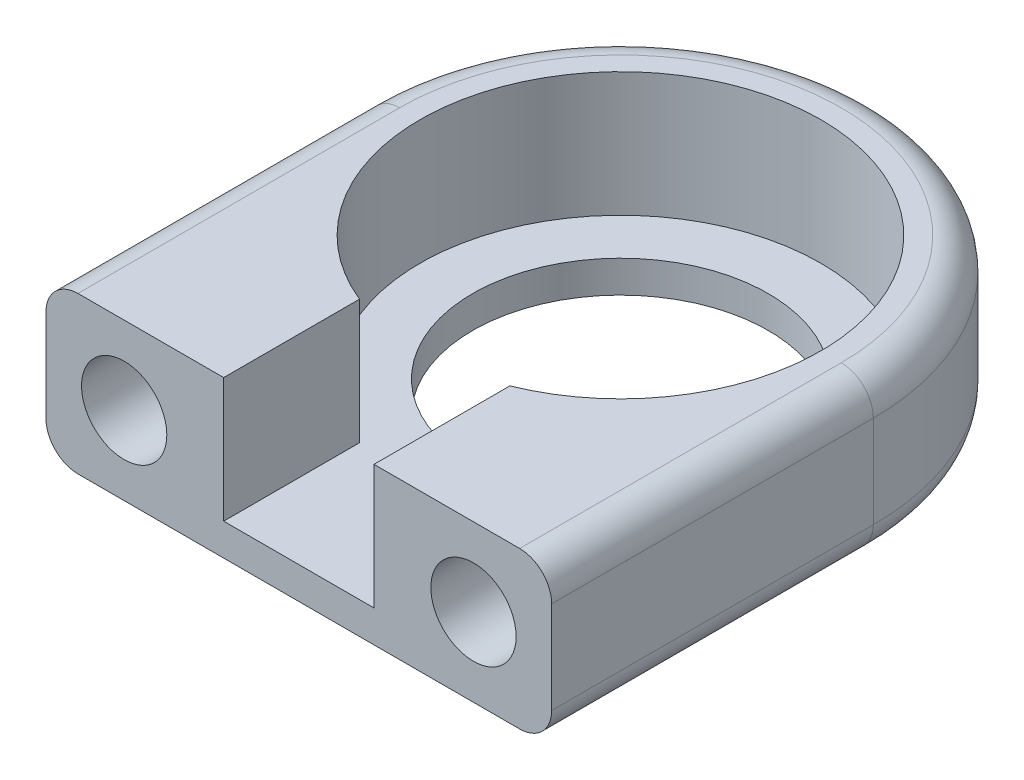
ISO-10303-21;
HEADER;
FILE_DESCRIPTION(('STEP AP214'),'2;1');
FILE_NAME('part.step','',(''),(''),'','','');
FILE_SCHEMA(('AUTOMOTIVE_DESIGN { 1 0 10303 214 1 1 1 1 }'));
ENDSEC;
DATA;
#1=APPLICATION_CONTEXT('core data for automotive mechanical design processes');
#2=APPLICATION_PROTOCOL_DEFINITION('international standard','automotive_design',2000,#1);
#3=PRODUCT_CONTEXT('',#1,'mechanical');
#4=PRODUCT('Part','Part','',(#3));
#5=PRODUCT_RELATED_PRODUCT_CATEGORY('part','',(#4));
#6=PRODUCT_DEFINITION_FORMATION('','',#4);
#7=PRODUCT_DEFINITION_CONTEXT('part definition',#1,'design');
#8=PRODUCT_DEFINITION('design','',#6,#7);
#9=PRODUCT_DEFINITION_SHAPE('','',#8);
#10=(LENGTH_UNIT() NAMED_UNIT(*) SI_UNIT(.MILLI.,.METRE.));
#11=(NAMED_UNIT(*) PLANE_ANGLE_UNIT() SI_UNIT($,.RADIAN.));
#12=(NAMED_UNIT(*) SI_UNIT($,.STERADIAN.) SOLID_ANGLE_UNIT());
#13=UNCERTAINTY_MEASURE_WITH_UNIT(LENGTH_MEASURE(1.E-05),#10,'distance_accuracy_value','');
#14=(GEOMETRIC_REPRESENTATION_CONTEXT(3) GLOBAL_UNCERTAINTY_ASSIGNED_CONTEXT((#13)) GLOBAL_UNIT_ASSIGNED_CONTEXT((#10,
#11,#12)) REPRESENTATION_CONTEXT('',''));
#15=CARTESIAN_POINT('',(0.,0.,0.));
#16=DIRECTION('',(0.,0.,1.));
#17=DIRECTION('',(1.,0.,0.));
#18=AXIS2_PLACEMENT_3D('',#15,#16,#17);
#19=CARTESIAN_POINT('',(0.,11.,0.));
#20=DIRECTION('',(0.,-1.,0.));
#21=DIRECTION('',(0.,0.,-1.));
#22=AXIS2_PLACEMENT_3D('',#19,#20,#21);
#23=CYLINDRICAL_SURFACE('',#22,14.0975);
#24=DIRECTION('',(0.,-1.,0.));
#25=VECTOR('',#24,1.);
#26=CARTESIAN_POINT('',(5.2875,11.,13.0683529949263));
#27=LINE('',#26,#25);
#28=CARTESIAN_POINT('',(5.2875,11.,13.0683529949263));
#29=VERTEX_POINT('',#28);
#30=CARTESIAN_POINT('',(5.2875,2.25,13.0683529949263));
#31=VERTEX_POINT('',#30);
#32=EDGE_CURVE('E141',#29,#31,#27,.T.);
#33=ORIENTED_EDGE('',*,*,#32,.F.);
#34=CARTESIAN_POINT('',(0.,11.,0.));
#35=DIRECTION('',(0.,1.,0.));
#36=DIRECTION('',(0.,0.,1.));
#37=AXIS2_PLACEMENT_3D('',#34,#35,#36);
#38=CIRCLE('',#37,14.0975);
#39=CARTESIAN_POINT('',(-5.2875,11.,13.0683529949263));
#40=VERTEX_POINT('',#39);
#41=EDGE_CURVE('E176',#29,#40,#38,.T.);
#42=ORIENTED_EDGE('',*,*,#41,.T.);
#43=DIRECTION('',(0.,-1.,0.));
#44=VECTOR('',#43,1.);
#45=CARTESIAN_POINT('',(-5.2875,11.,13.0683529949263));
#46=LINE('',#45,#44);
#47=CARTESIAN_POINT('',(-5.2875,2.25,13.0683529949263));
#48=VERTEX_POINT('',#47);
#49=EDGE_CURVE('E161',#48,#40,#46,.F.);
#50=ORIENTED_EDGE('',*,*,#49,.F.);
#51=CARTESIAN_POINT('',(0.,2.25,0.));
#52=DIRECTION('',(0.,-1.,0.));
#53=DIRECTION('',(0.,0.,-1.));
#54=AXIS2_PLACEMENT_3D('',#51,#52,#53);
#55=CIRCLE('',#54,14.0975);
#56=EDGE_CURVE('E173',#48,#31,#55,.T.);
#57=ORIENTED_EDGE('',*,*,#56,.T.);
#58=EDGE_LOOP('',(#33,#42,#50,#57));
#59=FACE_BOUND('',#58,.T.);
#60=ADVANCED_FACE('F39',(#59),#23,.F.);
#61=CARTESIAN_POINT('',(0.,11.,0.));
#62=DIRECTION('',(0.,1.,0.));
#63=DIRECTION('',(0.,0.,1.));
#64=AXIS2_PLACEMENT_3D('',#61,#62,#63);
#65=PLANE('',#64);
#66=DIRECTION('',(1.,0.,0.));
#67=VECTOR('',#66,1.);
#68=CARTESIAN_POINT('',(-17.7875,11.,22.6280707264182));
#69=LINE('',#68,#67);
#70=CARTESIAN_POINT('',(5.2875,11.,22.6280707264182));
#71=VERTEX_POINT('',#70);
#72=CARTESIAN_POINT('',(15.5375,11.,22.6280707264182));
#73=VERTEX_POINT('',#72);
#74=EDGE_CURVE('E160',#71,#73,#69,.T.);
#75=ORIENTED_EDGE('',*,*,#74,.T.);
#76=DIRECTION('',(0.,0.,-1.));
#77=VECTOR('',#76,1.);
#78=CARTESIAN_POINT('',(15.5375,11.,0.));
#79=LINE('',#78,#77);
#80=CARTESIAN_POINT('',(15.5375,11.,0.));
#81=VERTEX_POINT('',#80);
#82=EDGE_CURVE('E260',#73,#81,#79,.T.);
#83=ORIENTED_EDGE('',*,*,#82,.T.);
#84=CARTESIAN_POINT('',(0.,11.,0.));
#85=DIRECTION('',(0.,1.,0.));
#86=DIRECTION('',(0.,0.,1.));
#87=AXIS2_PLACEMENT_3D('',#84,#85,#86);
#88=CIRCLE('',#87,15.5375);
#89=CARTESIAN_POINT('',(-15.5375,11.,0.));
#90=VERTEX_POINT('',#89);
#91=EDGE_CURVE('E258',#81,#90,#88,.T.);
#92=ORIENTED_EDGE('',*,*,#91,.T.);
#93=DIRECTION('',(0.,0.,1.));
#94=VECTOR('',#93,1.);
#95=CARTESIAN_POINT('',(-15.5375,11.,22.6280707264182));
#96=LINE('',#95,#94);
#97=CARTESIAN_POINT('',(-15.5375,11.,22.6280707264182));
#98=VERTEX_POINT('',#97);
#99=EDGE_CURVE('E249',#90,#98,#96,.T.);
#100=ORIENTED_EDGE('',*,*,#99,.T.);
#101=CARTESIAN_POINT('',(-5.2875,11.,22.6280707264182));
#102=VERTEX_POINT('',#101);
#103=EDGE_CURVE('E180',#98,#102,#69,.T.);
#104=ORIENTED_EDGE('',*,*,#103,.T.);
#105=DIRECTION('',(0.,0.,1.));
#106=VECTOR('',#105,1.);
#107=CARTESIAN_POINT('',(-5.2875,11.,10.3998125081596));
#108=LINE('',#107,#106);
#109=EDGE_CURVE('E146',#40,#102,#108,.T.);
#110=ORIENTED_EDGE('',*,*,#109,.F.);
#111=ORIENTED_EDGE('',*,*,#41,.F.);
#112=DIRECTION('',(0.,0.,-1.));
#113=VECTOR('',#112,1.);
#114=CARTESIAN_POINT('',(5.2875,11.,22.6280707264182));
#115=LINE('',#114,#113);
#116=EDGE_CURVE('E289',#71,#29,#115,.T.);
#117=ORIENTED_EDGE('',*,*,#116,.F.);
#118=EDGE_LOOP('',(#75,#83,#92,#100,#104,#110,#111,#117));
#119=FACE_BOUND('',#118,.T.);
#120=ADVANCED_FACE('F282',(#119),#65,.T.);
#121=CARTESIAN_POINT('',(0.,0.,0.));
#122=DIRECTION('',(0.,1.,0.));
#123=DIRECTION('',(0.,0.,1.));
#124=AXIS2_PLACEMENT_3D('',#121,#122,#123);
#125=PLANE('',#124);
#126=CARTESIAN_POINT('',(0.,0.,0.));
#127=DIRECTION('',(0.,1.,0.));
#128=DIRECTION('',(0.,0.,1.));
#129=AXIS2_PLACEMENT_3D('',#126,#127,#128);
#130=CIRCLE('',#129,10.4);
#131=CARTESIAN_POINT('',(0.,0.,10.4));
#132=VERTEX_POINT('',#131);
#133=EDGE_CURVE('E170',#132,#132,#130,.T.);
#134=ORIENTED_EDGE('',*,*,#133,.T.);
#135=EDGE_LOOP('',(#134));
#136=FACE_BOUND('',#135,.T.);
#137=DIRECTION('',(1.,0.,0.));
#138=VECTOR('',#137,1.);
#139=CARTESIAN_POINT('',(-17.7875,0.,22.6280707264182));
#140=LINE('',#139,#138);
#141=CARTESIAN_POINT('',(-15.5375,0.,22.6280707264182));
#142=VERTEX_POINT('',#141);
#143=CARTESIAN_POINT('',(15.5375,0.,22.6280707264182));
#144=VERTEX_POINT('',#143);
#145=EDGE_CURVE('E179',#142,#144,#140,.T.);
#146=ORIENTED_EDGE('',*,*,#145,.F.);
#147=DIRECTION('',(0.,0.,1.));
#148=VECTOR('',#147,1.);
#149=CARTESIAN_POINT('',(-15.5375,0.,0.));
#150=LINE('',#149,#148);
#151=CARTESIAN_POINT('',(-15.5375,0.,0.));
#152=VERTEX_POINT('',#151);
#153=EDGE_CURVE('E241',#142,#152,#150,.F.);
#154=ORIENTED_EDGE('',*,*,#153,.T.);
#155=CARTESIAN_POINT('',(0.,0.,0.));
#156=DIRECTION('',(0.,1.,0.));
#157=DIRECTION('',(0.,0.,1.));
#158=AXIS2_PLACEMENT_3D('',#155,#156,#157);
#159=CIRCLE('',#158,15.5375);
#160=CARTESIAN_POINT('',(15.5375,0.,0.));
#161=VERTEX_POINT('',#160);
#162=EDGE_CURVE('E239',#152,#161,#159,.F.);
#163=ORIENTED_EDGE('',*,*,#162,.T.);
#164=DIRECTION('',(0.,0.,-1.));
#165=VECTOR('',#164,1.);
#166=CARTESIAN_POINT('',(15.5375,0.,0.));
#167=LINE('',#166,#165);
#168=EDGE_CURVE('E237',#161,#144,#167,.F.);
#169=ORIENTED_EDGE('',*,*,#168,.T.);
#170=EDGE_LOOP('',(#146,#154,#163,#169));
#171=FACE_BOUND('',#170,.T.);
#172=ADVANCED_FACE('F329',(#136,#171),#125,.F.);
#173=CARTESIAN_POINT('',(0.,11.,0.));
#174=DIRECTION('',(0.,-1.,0.));
#175=DIRECTION('',(0.,0.,-1.));
#176=AXIS2_PLACEMENT_3D('',#173,#174,#175);
#177=CYLINDRICAL_SURFACE('',#176,17.7875);
#178=DIRECTION('',(0.,-1.,0.));
#179=VECTOR('',#178,1.);
#180=CARTESIAN_POINT('',(-17.7875,11.,0.));
#181=LINE('',#180,#179);
#182=CARTESIAN_POINT('',(-17.7875,8.75,0.));
#183=VERTEX_POINT('',#182);
#184=CARTESIAN_POINT('',(-17.7875,2.25,0.));
#185=VERTEX_POINT('',#184);
#186=EDGE_CURVE('E190',#183,#185,#181,.T.);
#187=ORIENTED_EDGE('',*,*,#186,.F.);
#188=CARTESIAN_POINT('',(0.,8.75,0.));
#189=DIRECTION('',(0.,1.,0.));
#190=DIRECTION('',(0.,0.,1.));
#191=AXIS2_PLACEMENT_3D('',#188,#189,#190);
#192=CIRCLE('',#191,17.7875);
#193=CARTESIAN_POINT('',(17.7875,8.75,0.));
#194=VERTEX_POINT('',#193);
#195=EDGE_CURVE('E48',#183,#194,#192,.F.);
#196=ORIENTED_EDGE('',*,*,#195,.T.);
#197=DIRECTION('',(0.,-1.,0.));
#198=VECTOR('',#197,1.);
#199=CARTESIAN_POINT('',(17.7875,11.,0.));
#200=LINE('',#199,#198);
#201=CARTESIAN_POINT('',(17.7875,2.25,0.));
#202=VERTEX_POINT('',#201);
#203=EDGE_CURVE('E182',#194,#202,#200,.T.);
#204=ORIENTED_EDGE('',*,*,#203,.T.);
#205=CARTESIAN_POINT('',(0.,2.25,0.));
#206=DIRECTION('',(0.,1.,0.));
#207=DIRECTION('',(0.,0.,1.));
#208=AXIS2_PLACEMENT_3D('',#205,#206,#207);
#209=CIRCLE('',#208,17.7875);
#210=EDGE_CURVE('E243',#202,#185,#209,.T.);
#211=ORIENTED_EDGE('',*,*,#210,.T.);
#212=EDGE_LOOP('',(#187,#196,#204,#211));
#213=FACE_BOUND('',#212,.T.);
#214=ADVANCED_FACE('F338',(#213),#177,.T.);
#215=CARTESIAN_POINT('',(-17.7875,11.,0.));
#216=DIRECTION('',(1.,0.,0.));
#217=DIRECTION('',(0.,0.,-1.));
#218=AXIS2_PLACEMENT_3D('',#215,#216,#217);
#219=PLANE('',#218);
#220=DIRECTION('',(0.,-1.,0.));
#221=VECTOR('',#220,1.);
#222=CARTESIAN_POINT('',(-17.7875,11.,22.6280707264182));
#223=LINE('',#222,#221);
#224=CARTESIAN_POINT('',(-17.7875,8.75,22.6280707264182));
#225=VERTEX_POINT('',#224);
#226=CARTESIAN_POINT('',(-17.7875,2.25,22.6280707264182));
#227=VERTEX_POINT('',#226);
#228=EDGE_CURVE('E188',#225,#227,#223,.T.);
#229=ORIENTED_EDGE('',*,*,#228,.F.);
#230=DIRECTION('',(0.,0.,1.));
#231=VECTOR('',#230,1.);
#232=CARTESIAN_POINT('',(-17.7875,8.75,0.));
#233=LINE('',#232,#231);
#234=EDGE_CURVE('E11',#225,#183,#233,.F.);
#235=ORIENTED_EDGE('',*,*,#234,.T.);
#236=ORIENTED_EDGE('',*,*,#186,.T.);
#237=DIRECTION('',(0.,0.,1.));
#238=VECTOR('',#237,1.);
#239=CARTESIAN_POINT('',(-17.7875,2.25,0.));
#240=LINE('',#239,#238);
#241=EDGE_CURVE('E192',#185,#227,#240,.T.);
#242=ORIENTED_EDGE('',*,*,#241,.T.);
#243=EDGE_LOOP('',(#229,#235,#236,#242));
#244=FACE_BOUND('',#243,.T.);
#245=ADVANCED_FACE('F308',(#244),#219,.F.);
#246=CARTESIAN_POINT('',(-17.7875,11.,22.6280707264182));
#247=DIRECTION('',(0.,0.,-1.));
#248=DIRECTION('',(-1.,0.,0.));
#249=AXIS2_PLACEMENT_3D('',#246,#247,#248);
#250=PLANE('',#249);
#251=CARTESIAN_POINT('',(-12.2875,5.5,22.6280707264182));
#252=DIRECTION('',(0.,0.,1.));
#253=DIRECTION('',(1.,0.,0.));
#254=AXIS2_PLACEMENT_3D('',#251,#252,#253);
#255=CIRCLE('',#254,3.);
#256=CARTESIAN_POINT('',(-9.2875,5.5,22.6280707264182));
#257=VERTEX_POINT('',#256);
#258=EDGE_CURVE('E292',#257,#257,#255,.T.);
#259=ORIENTED_EDGE('',*,*,#258,.F.);
#260=EDGE_LOOP('',(#259));
#261=FACE_BOUND('',#260,.T.);
#262=CARTESIAN_POINT('',(12.2875,5.5,22.6280707264182));
#263=DIRECTION('',(0.,0.,1.));
#264=DIRECTION('',(1.,0.,0.));
#265=AXIS2_PLACEMENT_3D('',#262,#263,#264);
#266=CIRCLE('',#265,3.);
#267=CARTESIAN_POINT('',(15.2875,5.5,22.6280707264182));
#268=VERTEX_POINT('',#267);
#269=EDGE_CURVE('E256',#268,#268,#266,.T.);
#270=ORIENTED_EDGE('',*,*,#269,.F.);
#271=EDGE_LOOP('',(#270));
#272=FACE_BOUND('',#271,.T.);
#273=DIRECTION('',(0.,-1.,0.));
#274=VECTOR('',#273,1.);
#275=CARTESIAN_POINT('',(17.7875,11.,22.6280707264182));
#276=LINE('',#275,#274);
#277=CARTESIAN_POINT('',(17.7875,8.75,22.6280707264182));
#278=VERTEX_POINT('',#277);
#279=CARTESIAN_POINT('',(17.7875,2.25,22.6280707264182));
#280=VERTEX_POINT('',#279);
#281=EDGE_CURVE('E186',#278,#280,#276,.T.);
#282=ORIENTED_EDGE('',*,*,#281,.F.);
#283=CARTESIAN_POINT('',(15.5375,8.75,22.6280707264182));
#284=DIRECTION('',(0.,0.,-1.));
#285=DIRECTION('',(-1.,0.,0.));
#286=AXIS2_PLACEMENT_3D('',#283,#284,#285);
#287=CIRCLE('',#286,2.25);
#288=EDGE_CURVE('E266',#278,#73,#287,.F.);
#289=ORIENTED_EDGE('',*,*,#288,.T.);
#290=ORIENTED_EDGE('',*,*,#74,.F.);
#291=DIRECTION('',(0.,1.,0.));
#292=VECTOR('',#291,1.);
#293=CARTESIAN_POINT('',(5.2875,2.25,22.6280707264182));
#294=LINE('',#293,#292);
#295=CARTESIAN_POINT('',(5.2875,2.25,22.6280707264182));
#296=VERTEX_POINT('',#295);
#297=EDGE_CURVE('E138',#296,#71,#294,.T.);
#298=ORIENTED_EDGE('',*,*,#297,.F.);
#299=DIRECTION('',(1.,0.,0.));
#300=VECTOR('',#299,1.);
#301=CARTESIAN_POINT('',(-5.2875,2.25,22.6280707264182));
#302=LINE('',#301,#300);
#303=CARTESIAN_POINT('',(-5.2875,2.25,22.6280707264182));
#304=VERTEX_POINT('',#303);
#305=EDGE_CURVE('E150',#304,#296,#302,.T.);
#306=ORIENTED_EDGE('',*,*,#305,.F.);
#307=DIRECTION('',(0.,1.,0.));
#308=VECTOR('',#307,1.);
#309=CARTESIAN_POINT('',(-5.2875,2.25,22.6280707264182));
#310=LINE('',#309,#308);
#311=EDGE_CURVE('E154',#304,#102,#310,.T.);
#312=ORIENTED_EDGE('',*,*,#311,.T.);
#313=ORIENTED_EDGE('',*,*,#103,.F.);
#314=CARTESIAN_POINT('',(-15.5375,8.75,22.6280707264182));
#315=DIRECTION('',(0.,0.,-1.));
#316=DIRECTION('',(-1.,0.,0.));
#317=AXIS2_PLACEMENT_3D('',#314,#315,#316);
#318=CIRCLE('',#317,2.25);
#319=EDGE_CURVE('E62',#98,#225,#318,.F.);
#320=ORIENTED_EDGE('',*,*,#319,.T.);
#321=ORIENTED_EDGE('',*,*,#228,.T.);
#322=CARTESIAN_POINT('',(-15.5375,2.25,22.6280707264182));
#323=DIRECTION('',(0.,0.,-1.));
#324=DIRECTION('',(-1.,0.,0.));
#325=AXIS2_PLACEMENT_3D('',#322,#323,#324);
#326=CIRCLE('',#325,2.25);
#327=EDGE_CURVE('E235',#227,#142,#326,.F.);
#328=ORIENTED_EDGE('',*,*,#327,.T.);
#329=ORIENTED_EDGE('',*,*,#145,.T.);
#330=CARTESIAN_POINT('',(15.5375,2.25,22.6280707264182));
#331=DIRECTION('',(0.,0.,-1.));
#332=DIRECTION('',(-1.,0.,0.));
#333=AXIS2_PLACEMENT_3D('',#330,#331,#332);
#334=CIRCLE('',#333,2.25);
#335=EDGE_CURVE('E232',#144,#280,#334,.F.);
#336=ORIENTED_EDGE('',*,*,#335,.T.);
#337=EDGE_LOOP('',(#282,#289,#290,#298,#306,#312,#313,#320,#321,#328,#329,#336));
#338=FACE_BOUND('',#337,.T.);
#339=ADVANCED_FACE('F158',(#261,#272,#338),#250,.F.);
#340=CARTESIAN_POINT('',(17.7875,11.,0.));
#341=DIRECTION('',(-1.,0.,0.));
#342=DIRECTION('',(0.,0.,1.));
#343=AXIS2_PLACEMENT_3D('',#340,#341,#342);
#344=PLANE('',#343);
#345=ORIENTED_EDGE('',*,*,#203,.F.);
#346=DIRECTION('',(0.,0.,-1.));
#347=VECTOR('',#346,1.);
#348=CARTESIAN_POINT('',(17.7875,8.75,22.6280707264182));
#349=LINE('',#348,#347);
#350=EDGE_CURVE('E263',#194,#278,#349,.F.);
#351=ORIENTED_EDGE('',*,*,#350,.T.);
#352=ORIENTED_EDGE('',*,*,#281,.T.);
#353=DIRECTION('',(0.,0.,-1.));
#354=VECTOR('',#353,1.);
#355=CARTESIAN_POINT('',(17.7875,2.25,0.));
#356=LINE('',#355,#354);
#357=EDGE_CURVE('E246',#280,#202,#356,.T.);
#358=ORIENTED_EDGE('',*,*,#357,.T.);
#359=EDGE_LOOP('',(#345,#351,#352,#358));
#360=FACE_BOUND('',#359,.T.);
#361=ADVANCED_FACE('F217',(#360),#344,.F.);
#362=CARTESIAN_POINT('',(0.,2.25,0.));
#363=DIRECTION('',(0.,-1.,0.));
#364=DIRECTION('',(0.,0.,-1.));
#365=AXIS2_PLACEMENT_3D('',#362,#363,#364);
#366=PLANE('',#365);
#367=ORIENTED_EDGE('',*,*,#56,.F.);
#368=DIRECTION('',(0.,0.,1.));
#369=VECTOR('',#368,1.);
#370=CARTESIAN_POINT('',(-5.2875,2.25,10.3998125081596));
#371=LINE('',#370,#369);
#372=EDGE_CURVE('E145',#48,#304,#371,.T.);
#373=ORIENTED_EDGE('',*,*,#372,.T.);
#374=ORIENTED_EDGE('',*,*,#305,.T.);
#375=DIRECTION('',(0.,0.,-1.));
#376=VECTOR('',#375,1.);
#377=CARTESIAN_POINT('',(5.2875,2.25,22.6280707264182));
#378=LINE('',#377,#376);
#379=EDGE_CURVE('E134',#296,#31,#378,.T.);
#380=ORIENTED_EDGE('',*,*,#379,.T.);
#381=EDGE_LOOP('',(#367,#373,#374,#380));
#382=FACE_BOUND('',#381,.T.);
#383=CARTESIAN_POINT('',(0.,2.25,0.));
#384=DIRECTION('',(0.,1.,0.));
#385=DIRECTION('',(-0.00600464804505152,0.,0.999981971938422));
#386=AXIS2_PLACEMENT_3D('',#383,#384,#385);
#387=CIRCLE('',#386,10.4);
#388=CARTESIAN_POINT('',(-0.0624483396685354,2.25,10.3998125081596));
#389=VERTEX_POINT('',#388);
#390=CARTESIAN_POINT('',(0.0624483396685354,2.25,10.3998125081596));
#391=VERTEX_POINT('',#390);
#392=EDGE_CURVE('E169',#389,#391,#387,.T.);
#393=ORIENTED_EDGE('',*,*,#392,.F.);
#394=CARTESIAN_POINT('',(0.,2.25,0.));
#395=DIRECTION('',(0.,1.,0.));
#396=DIRECTION('',(0.,0.,1.));
#397=AXIS2_PLACEMENT_3D('',#394,#395,#396);
#398=CIRCLE('',#397,10.4);
#399=EDGE_CURVE('E174',#391,#389,#398,.T.);
#400=ORIENTED_EDGE('',*,*,#399,.F.);
#401=EDGE_LOOP('',(#393,#400));
#402=FACE_BOUND('',#401,.T.);
#403=ADVANCED_FACE('F151',(#382,#402),#366,.F.);
#404=CARTESIAN_POINT('',(0.,0.,0.));
#405=DIRECTION('',(0.,1.,0.));
#406=DIRECTION('',(0.,0.,1.));
#407=AXIS2_PLACEMENT_3D('',#404,#405,#406);
#408=CYLINDRICAL_SURFACE('',#407,10.4);
#409=ORIENTED_EDGE('',*,*,#133,.F.);
#410=EDGE_LOOP('',(#409));
#411=FACE_BOUND('',#410,.T.);
#412=ORIENTED_EDGE('',*,*,#399,.T.);
#413=ORIENTED_EDGE('',*,*,#392,.T.);
#414=EDGE_LOOP('',(#412,#413));
#415=FACE_BOUND('',#414,.T.);
#416=ADVANCED_FACE('F202',(#411,#415),#408,.F.);
#417=CARTESIAN_POINT('',(5.2875,2.25,22.6280707264182));
#418=DIRECTION('',(1.,0.,0.));
#419=DIRECTION('',(0.,0.,-1.));
#420=AXIS2_PLACEMENT_3D('',#417,#418,#419);
#421=PLANE('',#420);
#422=ORIENTED_EDGE('',*,*,#32,.T.);
#423=ORIENTED_EDGE('',*,*,#379,.F.);
#424=ORIENTED_EDGE('',*,*,#297,.T.);
#425=ORIENTED_EDGE('',*,*,#116,.T.);
#426=EDGE_LOOP('',(#422,#423,#424,#425));
#427=FACE_BOUND('',#426,.T.);
#428=ADVANCED_FACE('F136',(#427),#421,.F.);
#429=CARTESIAN_POINT('',(-5.2875,2.25,10.3998125081596));
#430=DIRECTION('',(-1.,0.,0.));
#431=DIRECTION('',(0.,0.,1.));
#432=AXIS2_PLACEMENT_3D('',#429,#430,#431);
#433=PLANE('',#432);
#434=ORIENTED_EDGE('',*,*,#49,.T.);
#435=ORIENTED_EDGE('',*,*,#109,.T.);
#436=ORIENTED_EDGE('',*,*,#311,.F.);
#437=ORIENTED_EDGE('',*,*,#372,.F.);
#438=EDGE_LOOP('',(#434,#435,#436,#437));
#439=FACE_BOUND('',#438,.T.);
#440=ADVANCED_FACE('F286',(#439),#433,.F.);
#441=CARTESIAN_POINT('',(12.2875,5.5,13.6280707264182));
#442=DIRECTION('',(0.,0.,1.));
#443=DIRECTION('',(1.,0.,0.));
#444=AXIS2_PLACEMENT_3D('',#441,#442,#443);
#445=CYLINDRICAL_SURFACE('',#444,3.);
#446=CARTESIAN_POINT('',(12.2875,5.5,13.6280707264182));
#447=DIRECTION('',(0.,0.,1.));
#448=DIRECTION('',(1.,0.,0.));
#449=AXIS2_PLACEMENT_3D('',#446,#447,#448);
#450=CIRCLE('',#449,3.);
#451=CARTESIAN_POINT('',(15.2875,5.5,13.6280707264182));
#452=VERTEX_POINT('',#451);
#453=EDGE_CURVE('E298',#452,#452,#450,.T.);
#454=ORIENTED_EDGE('',*,*,#453,.F.);
#455=EDGE_LOOP('',(#454));
#456=FACE_BOUND('',#455,.T.);
#457=ORIENTED_EDGE('',*,*,#269,.T.);
#458=EDGE_LOOP('',(#457));
#459=FACE_BOUND('',#458,.T.);
#460=ADVANCED_FACE('F312',(#456,#459),#445,.F.);
#461=CARTESIAN_POINT('',(12.2875,5.5,13.6280707264182));
#462=DIRECTION('',(0.,0.,1.));
#463=DIRECTION('',(1.,0.,0.));
#464=AXIS2_PLACEMENT_3D('',#461,#462,#463);
#465=PLANE('',#464);
#466=ORIENTED_EDGE('',*,*,#453,.T.);
#467=EDGE_LOOP('',(#466));
#468=FACE_BOUND('',#467,.T.);
#469=ADVANCED_FACE('F314',(#468),#465,.T.);
#470=CARTESIAN_POINT('',(-12.2875,5.5,13.6280707264182));
#471=DIRECTION('',(0.,0.,1.));
#472=DIRECTION('',(1.,0.,0.));
#473=AXIS2_PLACEMENT_3D('',#470,#471,#472);
#474=CYLINDRICAL_SURFACE('',#473,3.);
#475=CARTESIAN_POINT('',(-12.2875,5.5,13.6280707264182));
#476=DIRECTION('',(0.,0.,1.));
#477=DIRECTION('',(1.,0.,0.));
#478=AXIS2_PLACEMENT_3D('',#475,#476,#477);
#479=CIRCLE('',#478,3.);
#480=CARTESIAN_POINT('',(-9.2875,5.5,13.6280707264182));
#481=VERTEX_POINT('',#480);
#482=EDGE_CURVE('E290',#481,#481,#479,.T.);
#483=ORIENTED_EDGE('',*,*,#482,.F.);
#484=EDGE_LOOP('',(#483));
#485=FACE_BOUND('',#484,.T.);
#486=ORIENTED_EDGE('',*,*,#258,.T.);
#487=EDGE_LOOP('',(#486));
#488=FACE_BOUND('',#487,.T.);
#489=ADVANCED_FACE('F304',(#485,#488),#474,.F.);
#490=CARTESIAN_POINT('',(-12.2875,5.5,13.6280707264182));
#491=DIRECTION('',(0.,0.,1.));
#492=DIRECTION('',(1.,0.,0.));
#493=AXIS2_PLACEMENT_3D('',#490,#491,#492);
#494=PLANE('',#493);
#495=ORIENTED_EDGE('',*,*,#482,.T.);
#496=EDGE_LOOP('',(#495));
#497=FACE_BOUND('',#496,.T.);
#498=ADVANCED_FACE('F361',(#497),#494,.T.);
#499=CARTESIAN_POINT('',(15.5375,2.25,0.));
#500=DIRECTION('',(0.,0.,-1.));
#501=DIRECTION('',(-1.,0.,0.));
#502=AXIS2_PLACEMENT_3D('',#499,#500,#501);
#503=CYLINDRICAL_SURFACE('',#502,2.25);
#504=ORIENTED_EDGE('',*,*,#335,.F.);
#505=ORIENTED_EDGE('',*,*,#168,.F.);
#506=CARTESIAN_POINT('',(15.5375,2.25,0.));
#507=DIRECTION('',(0.,0.,-1.));
#508=DIRECTION('',(-1.,0.,0.));
#509=AXIS2_PLACEMENT_3D('',#506,#507,#508);
#510=CIRCLE('',#509,2.25);
#511=EDGE_CURVE('E253',#202,#161,#510,.T.);
#512=ORIENTED_EDGE('',*,*,#511,.F.);
#513=ORIENTED_EDGE('',*,*,#357,.F.);
#514=EDGE_LOOP('',(#504,#505,#512,#513));
#515=FACE_BOUND('',#514,.T.);
#516=ADVANCED_FACE('F351',(#515),#503,.T.);
#517=CARTESIAN_POINT('',(0.,2.25,0.));
#518=DIRECTION('',(0.,1.,0.));
#519=DIRECTION('',(0.,0.,1.));
#520=AXIS2_PLACEMENT_3D('',#517,#518,#519);
#521=TOROIDAL_SURFACE('',#520,15.5375,2.25);
#522=ORIENTED_EDGE('',*,*,#511,.T.);
#523=ORIENTED_EDGE('',*,*,#162,.F.);
#524=CARTESIAN_POINT('',(-15.5375,2.25,0.));
#525=DIRECTION('',(0.,0.,1.));
#526=DIRECTION('',(1.,0.,0.));
#527=AXIS2_PLACEMENT_3D('',#524,#525,#526);
#528=CIRCLE('',#527,2.25);
#529=EDGE_CURVE('E250',#185,#152,#528,.T.);
#530=ORIENTED_EDGE('',*,*,#529,.F.);
#531=ORIENTED_EDGE('',*,*,#210,.F.);
#532=EDGE_LOOP('',(#522,#523,#530,#531));
#533=FACE_BOUND('',#532,.T.);
#534=ADVANCED_FACE('F353',(#533),#521,.T.);
#535=CARTESIAN_POINT('',(-15.5375,2.25,0.));
#536=DIRECTION('',(0.,0.,1.));
#537=DIRECTION('',(1.,0.,0.));
#538=AXIS2_PLACEMENT_3D('',#535,#536,#537);
#539=CYLINDRICAL_SURFACE('',#538,2.25);
#540=ORIENTED_EDGE('',*,*,#529,.T.);
#541=ORIENTED_EDGE('',*,*,#153,.F.);
#542=ORIENTED_EDGE('',*,*,#327,.F.);
#543=ORIENTED_EDGE('',*,*,#241,.F.);
#544=EDGE_LOOP('',(#540,#541,#542,#543));
#545=FACE_BOUND('',#544,.T.);
#546=ADVANCED_FACE('F344',(#545),#539,.T.);
#547=CARTESIAN_POINT('',(-15.5375,8.75,0.));
#548=DIRECTION('',(0.,0.,-1.));
#549=DIRECTION('',(-1.,0.,0.));
#550=AXIS2_PLACEMENT_3D('',#547,#548,#549);
#551=CYLINDRICAL_SURFACE('',#550,2.25);
#552=ORIENTED_EDGE('',*,*,#319,.F.);
#553=ORIENTED_EDGE('',*,*,#99,.F.);
#554=CARTESIAN_POINT('',(-15.5375,8.75,0.));
#555=DIRECTION('',(0.,0.,-1.));
#556=DIRECTION('',(-1.,0.,0.));
#557=AXIS2_PLACEMENT_3D('',#554,#555,#556);
#558=CIRCLE('',#557,2.25);
#559=EDGE_CURVE('E43',#183,#90,#558,.T.);
#560=ORIENTED_EDGE('',*,*,#559,.F.);
#561=ORIENTED_EDGE('',*,*,#234,.F.);
#562=EDGE_LOOP('',(#552,#553,#560,#561));
#563=FACE_BOUND('',#562,.T.);
#564=ADVANCED_FACE('F41',(#563),#551,.T.);
#565=CARTESIAN_POINT('',(0.,8.75,0.));
#566=DIRECTION('',(0.,1.,0.));
#567=DIRECTION('',(0.,0.,1.));
#568=AXIS2_PLACEMENT_3D('',#565,#566,#567);
#569=TOROIDAL_SURFACE('',#568,15.5375,2.25);
#570=ORIENTED_EDGE('',*,*,#559,.T.);
#571=ORIENTED_EDGE('',*,*,#91,.F.);
#572=CARTESIAN_POINT('',(15.5375,8.75,0.));
#573=DIRECTION('',(0.,0.,1.));
#574=DIRECTION('',(1.,0.,0.));
#575=AXIS2_PLACEMENT_3D('',#572,#573,#574);
#576=CIRCLE('',#575,2.25);
#577=EDGE_CURVE('E268',#194,#81,#576,.T.);
#578=ORIENTED_EDGE('',*,*,#577,.F.);
#579=ORIENTED_EDGE('',*,*,#195,.F.);
#580=EDGE_LOOP('',(#570,#571,#578,#579));
#581=FACE_BOUND('',#580,.T.);
#582=ADVANCED_FACE('F278',(#581),#569,.T.);
#583=CARTESIAN_POINT('',(15.5375,8.75,0.));
#584=DIRECTION('',(0.,0.,1.));
#585=DIRECTION('',(1.,0.,0.));
#586=AXIS2_PLACEMENT_3D('',#583,#584,#585);
#587=CYLINDRICAL_SURFACE('',#586,2.25);
#588=ORIENTED_EDGE('',*,*,#288,.F.);
#589=ORIENTED_EDGE('',*,*,#350,.F.);
#590=ORIENTED_EDGE('',*,*,#577,.T.);
#591=ORIENTED_EDGE('',*,*,#82,.F.);
#592=EDGE_LOOP('',(#588,#589,#590,#591));
#593=FACE_BOUND('',#592,.T.);
#594=ADVANCED_FACE('F331',(#593),#587,.T.);
#595=CLOSED_SHELL('',(#60,#120,#172,#214,#245,#339,#361,#403,#416,#428,#440,#460,#469,#489,#498,
#516,#534,#546,#564,#582,#594));
#596=MANIFOLD_SOLID_BREP('B2',#595);
#597=ADVANCED_BREP_SHAPE_REPRESENTATION('',(#18,#596),#14);
#598=SHAPE_DEFINITION_REPRESENTATION(#9,#597);
ENDSEC;
END-ISO-10303-21;
